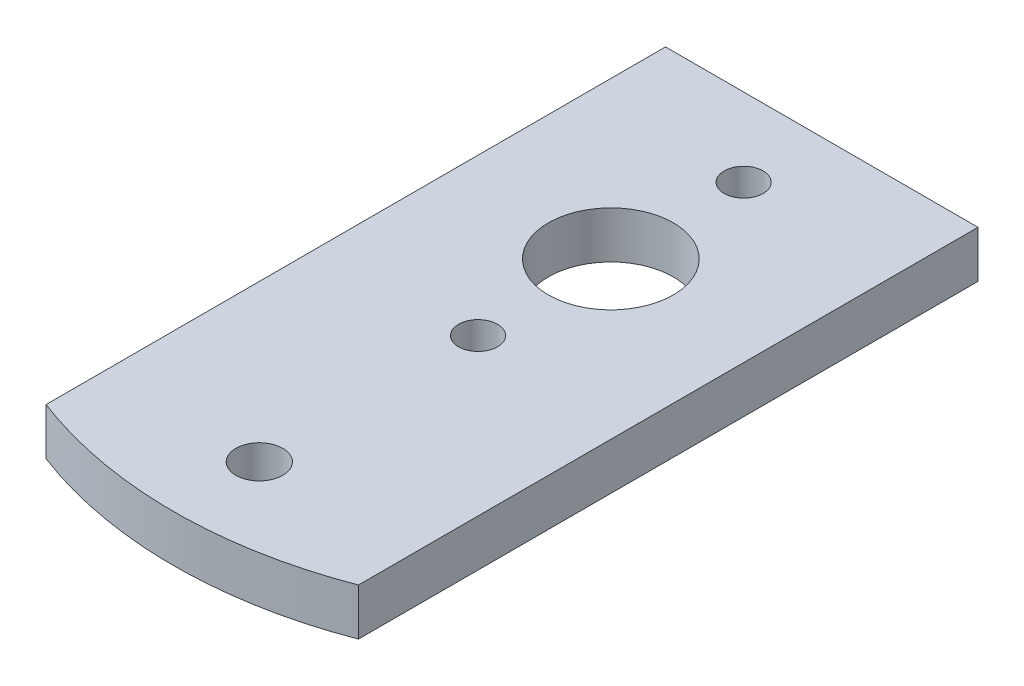
ISO-10303-21;
HEADER;
FILE_DESCRIPTION(('STEP AP214'),'2;1');
FILE_NAME('part.step','',(''),(''),'','','');
FILE_SCHEMA(('AUTOMOTIVE_DESIGN { 1 0 10303 214 1 1 1 1 }'));
ENDSEC;
DATA;
#1=APPLICATION_CONTEXT('core data for automotive mechanical design processes');
#2=APPLICATION_PROTOCOL_DEFINITION('international standard','automotive_design',2000,#1);
#3=PRODUCT_CONTEXT('',#1,'mechanical');
#4=PRODUCT('Part','Part','',(#3));
#5=PRODUCT_RELATED_PRODUCT_CATEGORY('part','',(#4));
#6=PRODUCT_DEFINITION_FORMATION('','',#4);
#7=PRODUCT_DEFINITION_CONTEXT('part definition',#1,'design');
#8=PRODUCT_DEFINITION('design','',#6,#7);
#9=PRODUCT_DEFINITION_SHAPE('','',#8);
#10=(LENGTH_UNIT() NAMED_UNIT(*) SI_UNIT(.MILLI.,.METRE.));
#11=(NAMED_UNIT(*) PLANE_ANGLE_UNIT() SI_UNIT($,.RADIAN.));
#12=(NAMED_UNIT(*) SI_UNIT($,.STERADIAN.) SOLID_ANGLE_UNIT());
#13=UNCERTAINTY_MEASURE_WITH_UNIT(LENGTH_MEASURE(1.E-05),#10,'distance_accuracy_value','');
#14=(GEOMETRIC_REPRESENTATION_CONTEXT(3) GLOBAL_UNCERTAINTY_ASSIGNED_CONTEXT((#13)) GLOBAL_UNIT_ASSIGNED_CONTEXT((#10,
#11,#12)) REPRESENTATION_CONTEXT('',''));
#15=CARTESIAN_POINT('',(0.,0.,0.));
#16=DIRECTION('',(0.,0.,1.));
#17=DIRECTION('',(1.,0.,0.));
#18=AXIS2_PLACEMENT_3D('',#15,#16,#17);
#19=CARTESIAN_POINT('',(0.,3.,0.));
#20=DIRECTION('',(0.,-1.,0.));
#21=DIRECTION('',(0.,0.,-1.));
#22=AXIS2_PLACEMENT_3D('',#19,#20,#21);
#23=PLANE('',#22);
#24=CARTESIAN_POINT('',(0.,3.,13.));
#25=DIRECTION('',(0.,1.,0.));
#26=DIRECTION('',(0.,0.,1.));
#27=AXIS2_PLACEMENT_3D('',#24,#25,#26);
#28=CIRCLE('',#27,1.5);
#29=CARTESIAN_POINT('',(0.,3.,14.5));
#30=VERTEX_POINT('',#29);
#31=EDGE_CURVE('E130',#30,#30,#28,.T.);
#32=ORIENTED_EDGE('',*,*,#31,.F.);
#33=EDGE_LOOP('',(#32));
#34=FACE_BOUND('',#33,.T.);
#35=CARTESIAN_POINT('',(0.,3.,-9.5));
#36=DIRECTION('',(0.,1.,0.));
#37=DIRECTION('',(0.,0.,1.));
#38=AXIS2_PLACEMENT_3D('',#35,#36,#37);
#39=CIRCLE('',#38,4.);
#40=CARTESIAN_POINT('',(0.,3.,-5.5));
#41=VERTEX_POINT('',#40);
#42=EDGE_CURVE('E122',#41,#41,#39,.T.);
#43=ORIENTED_EDGE('',*,*,#42,.F.);
#44=EDGE_LOOP('',(#43));
#45=FACE_BOUND('',#44,.T.);
#46=CARTESIAN_POINT('',(0.,3.,-1.));
#47=DIRECTION('',(0.,1.,0.));
#48=DIRECTION('',(0.,0.,1.));
#49=AXIS2_PLACEMENT_3D('',#46,#47,#48);
#50=CIRCLE('',#49,1.25);
#51=CARTESIAN_POINT('',(0.,3.,0.25));
#52=VERTEX_POINT('',#51);
#53=EDGE_CURVE('E114',#52,#52,#50,.T.);
#54=ORIENTED_EDGE('',*,*,#53,.F.);
#55=EDGE_LOOP('',(#54));
#56=FACE_BOUND('',#55,.T.);
#57=CARTESIAN_POINT('',(0.,3.,-18.));
#58=DIRECTION('',(0.,1.,0.));
#59=DIRECTION('',(0.,0.,1.));
#60=AXIS2_PLACEMENT_3D('',#57,#58,#59);
#61=CIRCLE('',#60,1.25);
#62=CARTESIAN_POINT('',(0.,3.,-16.75));
#63=VERTEX_POINT('',#62);
#64=EDGE_CURVE('E105',#63,#63,#61,.T.);
#65=ORIENTED_EDGE('',*,*,#64,.F.);
#66=EDGE_LOOP('',(#65));
#67=FACE_BOUND('',#66,.T.);
#68=CARTESIAN_POINT('',(0.,3.,-9.5));
#69=DIRECTION('',(0.,1.,0.));
#70=DIRECTION('',(0.,0.,1.));
#71=AXIS2_PLACEMENT_3D('',#68,#69,#70);
#72=CIRCLE('',#71,28.);
#73=CARTESIAN_POINT('',(-10.,3.,16.653393661244));
#74=VERTEX_POINT('',#73);
#75=CARTESIAN_POINT('',(10.,3.,16.653393661244));
#76=VERTEX_POINT('',#75);
#77=EDGE_CURVE('E55',#74,#76,#72,.T.);
#78=ORIENTED_EDGE('',*,*,#77,.T.);
#79=DIRECTION('',(0.,0.,-1.));
#80=VECTOR('',#79,1.);
#81=CARTESIAN_POINT('',(10.,3.,23.));
#82=LINE('',#81,#80);
#83=CARTESIAN_POINT('',(10.,3.,-23.));
#84=VERTEX_POINT('',#83);
#85=EDGE_CURVE('E98',#76,#84,#82,.T.);
#86=ORIENTED_EDGE('',*,*,#85,.T.);
#87=DIRECTION('',(-1.,0.,0.));
#88=VECTOR('',#87,1.);
#89=CARTESIAN_POINT('',(-10.,3.,-23.));
#90=LINE('',#89,#88);
#91=CARTESIAN_POINT('',(-10.,3.,-23.));
#92=VERTEX_POINT('',#91);
#93=EDGE_CURVE('E64',#84,#92,#90,.T.);
#94=ORIENTED_EDGE('',*,*,#93,.T.);
#95=DIRECTION('',(0.,0.,1.));
#96=VECTOR('',#95,1.);
#97=CARTESIAN_POINT('',(-10.,3.,23.));
#98=LINE('',#97,#96);
#99=EDGE_CURVE('E91',#92,#74,#98,.T.);
#100=ORIENTED_EDGE('',*,*,#99,.T.);
#101=EDGE_LOOP('',(#78,#86,#94,#100));
#102=FACE_BOUND('',#101,.T.);
#103=ADVANCED_FACE('F39',(#34,#45,#56,#67,#102),#23,.F.);
#104=CARTESIAN_POINT('',(0.,0.,0.));
#105=DIRECTION('',(0.,-1.,0.));
#106=DIRECTION('',(0.,0.,-1.));
#107=AXIS2_PLACEMENT_3D('',#104,#105,#106);
#108=PLANE('',#107);
#109=CARTESIAN_POINT('',(0.,0.,-9.5));
#110=DIRECTION('',(0.,1.,0.));
#111=DIRECTION('',(0.,0.,1.));
#112=AXIS2_PLACEMENT_3D('',#109,#110,#111);
#113=CIRCLE('',#112,4.);
#114=CARTESIAN_POINT('',(0.,0.,-5.5));
#115=VERTEX_POINT('',#114);
#116=EDGE_CURVE('E126',#115,#115,#113,.T.);
#117=ORIENTED_EDGE('',*,*,#116,.T.);
#118=EDGE_LOOP('',(#117));
#119=FACE_BOUND('',#118,.T.);
#120=CARTESIAN_POINT('',(0.,0.,-18.));
#121=DIRECTION('',(0.,1.,0.));
#122=DIRECTION('',(0.,0.,1.));
#123=AXIS2_PLACEMENT_3D('',#120,#121,#122);
#124=CIRCLE('',#123,1.25);
#125=CARTESIAN_POINT('',(0.,0.,-16.75));
#126=VERTEX_POINT('',#125);
#127=EDGE_CURVE('E110',#126,#126,#124,.T.);
#128=ORIENTED_EDGE('',*,*,#127,.T.);
#129=EDGE_LOOP('',(#128));
#130=FACE_BOUND('',#129,.T.);
#131=CARTESIAN_POINT('',(0.,0.,-1.));
#132=DIRECTION('',(0.,1.,0.));
#133=DIRECTION('',(0.,0.,1.));
#134=AXIS2_PLACEMENT_3D('',#131,#132,#133);
#135=CIRCLE('',#134,1.25);
#136=CARTESIAN_POINT('',(0.,0.,0.25));
#137=VERTEX_POINT('',#136);
#138=EDGE_CURVE('E118',#137,#137,#135,.T.);
#139=ORIENTED_EDGE('',*,*,#138,.T.);
#140=EDGE_LOOP('',(#139));
#141=FACE_BOUND('',#140,.T.);
#142=CARTESIAN_POINT('',(0.,0.,13.));
#143=DIRECTION('',(0.,1.,0.));
#144=DIRECTION('',(0.,0.,1.));
#145=AXIS2_PLACEMENT_3D('',#142,#143,#144);
#146=CIRCLE('',#145,1.5);
#147=CARTESIAN_POINT('',(0.,0.,14.5));
#148=VERTEX_POINT('',#147);
#149=EDGE_CURVE('E134',#148,#148,#146,.T.);
#150=ORIENTED_EDGE('',*,*,#149,.T.);
#151=EDGE_LOOP('',(#150));
#152=FACE_BOUND('',#151,.T.);
#153=DIRECTION('',(0.,0.,-1.));
#154=VECTOR('',#153,1.);
#155=CARTESIAN_POINT('',(10.,0.,23.));
#156=LINE('',#155,#154);
#157=CARTESIAN_POINT('',(10.,0.,16.653393661244));
#158=VERTEX_POINT('',#157);
#159=CARTESIAN_POINT('',(10.,0.,-23.));
#160=VERTEX_POINT('',#159);
#161=EDGE_CURVE('E86',#158,#160,#156,.T.);
#162=ORIENTED_EDGE('',*,*,#161,.F.);
#163=CARTESIAN_POINT('',(0.,0.,-9.5));
#164=DIRECTION('',(0.,1.,0.));
#165=DIRECTION('',(0.,0.,1.));
#166=AXIS2_PLACEMENT_3D('',#163,#164,#165);
#167=CIRCLE('',#166,28.);
#168=CARTESIAN_POINT('',(-10.,0.,16.653393661244));
#169=VERTEX_POINT('',#168);
#170=EDGE_CURVE('E96',#169,#158,#167,.T.);
#171=ORIENTED_EDGE('',*,*,#170,.F.);
#172=DIRECTION('',(0.,0.,1.));
#173=VECTOR('',#172,1.);
#174=CARTESIAN_POINT('',(-10.,0.,23.));
#175=LINE('',#174,#173);
#176=CARTESIAN_POINT('',(-10.,0.,-23.));
#177=VERTEX_POINT('',#176);
#178=EDGE_CURVE('E85',#177,#169,#175,.T.);
#179=ORIENTED_EDGE('',*,*,#178,.F.);
#180=DIRECTION('',(-1.,0.,0.));
#181=VECTOR('',#180,1.);
#182=CARTESIAN_POINT('',(-10.,0.,-23.));
#183=LINE('',#182,#181);
#184=EDGE_CURVE('E76',#160,#177,#183,.T.);
#185=ORIENTED_EDGE('',*,*,#184,.F.);
#186=EDGE_LOOP('',(#162,#171,#179,#185));
#187=FACE_BOUND('',#186,.T.);
#188=ADVANCED_FACE('F94',(#119,#130,#141,#152,#187),#108,.T.);
#189=CARTESIAN_POINT('',(10.,3.,23.));
#190=DIRECTION('',(-1.,0.,0.));
#191=DIRECTION('',(0.,0.,1.));
#192=AXIS2_PLACEMENT_3D('',#189,#190,#191);
#193=PLANE('',#192);
#194=DIRECTION('',(0.,1.,0.));
#195=VECTOR('',#194,1.);
#196=CARTESIAN_POINT('',(10.,0.,16.653393661244));
#197=LINE('',#196,#195);
#198=EDGE_CURVE('E142',#158,#76,#197,.T.);
#199=ORIENTED_EDGE('',*,*,#198,.F.);
#200=ORIENTED_EDGE('',*,*,#161,.T.);
#201=DIRECTION('',(0.,-1.,0.));
#202=VECTOR('',#201,1.);
#203=CARTESIAN_POINT('',(10.,3.,-23.));
#204=LINE('',#203,#202);
#205=EDGE_CURVE('E11',#84,#160,#204,.T.);
#206=ORIENTED_EDGE('',*,*,#205,.F.);
#207=ORIENTED_EDGE('',*,*,#85,.F.);
#208=EDGE_LOOP('',(#199,#200,#206,#207));
#209=FACE_BOUND('',#208,.T.);
#210=ADVANCED_FACE('F41',(#209),#193,.F.);
#211=CARTESIAN_POINT('',(-10.,3.,23.));
#212=DIRECTION('',(1.,0.,0.));
#213=DIRECTION('',(0.,0.,-1.));
#214=AXIS2_PLACEMENT_3D('',#211,#212,#213);
#215=PLANE('',#214);
#216=DIRECTION('',(0.,1.,0.));
#217=VECTOR('',#216,1.);
#218=CARTESIAN_POINT('',(-10.,0.,16.653393661244));
#219=LINE('',#218,#217);
#220=EDGE_CURVE('E138',#169,#74,#219,.T.);
#221=ORIENTED_EDGE('',*,*,#220,.T.);
#222=ORIENTED_EDGE('',*,*,#99,.F.);
#223=DIRECTION('',(0.,-1.,0.));
#224=VECTOR('',#223,1.);
#225=CARTESIAN_POINT('',(-10.,3.,-23.));
#226=LINE('',#225,#224);
#227=EDGE_CURVE('E48',#92,#177,#226,.T.);
#228=ORIENTED_EDGE('',*,*,#227,.T.);
#229=ORIENTED_EDGE('',*,*,#178,.T.);
#230=EDGE_LOOP('',(#221,#222,#228,#229));
#231=FACE_BOUND('',#230,.T.);
#232=ADVANCED_FACE('F90',(#231),#215,.F.);
#233=CARTESIAN_POINT('',(-10.,3.,-23.));
#234=DIRECTION('',(0.,0.,1.));
#235=DIRECTION('',(1.,0.,0.));
#236=AXIS2_PLACEMENT_3D('',#233,#234,#235);
#237=PLANE('',#236);
#238=ORIENTED_EDGE('',*,*,#184,.T.);
#239=ORIENTED_EDGE('',*,*,#227,.F.);
#240=ORIENTED_EDGE('',*,*,#93,.F.);
#241=ORIENTED_EDGE('',*,*,#205,.T.);
#242=EDGE_LOOP('',(#238,#239,#240,#241));
#243=FACE_BOUND('',#242,.T.);
#244=ADVANCED_FACE('F78',(#243),#237,.F.);
#245=CARTESIAN_POINT('',(0.,3.,-18.));
#246=DIRECTION('',(0.,-1.,0.));
#247=DIRECTION('',(0.,0.,-1.));
#248=AXIS2_PLACEMENT_3D('',#245,#246,#247);
#249=CYLINDRICAL_SURFACE('',#248,1.25);
#250=ORIENTED_EDGE('',*,*,#64,.T.);
#251=EDGE_LOOP('',(#250));
#252=FACE_BOUND('',#251,.T.);
#253=ORIENTED_EDGE('',*,*,#127,.F.);
#254=EDGE_LOOP('',(#253));
#255=FACE_BOUND('',#254,.T.);
#256=ADVANCED_FACE('F168',(#252,#255),#249,.F.);
#257=CARTESIAN_POINT('',(0.,3.,-1.));
#258=DIRECTION('',(0.,-1.,0.));
#259=DIRECTION('',(0.,0.,-1.));
#260=AXIS2_PLACEMENT_3D('',#257,#258,#259);
#261=CYLINDRICAL_SURFACE('',#260,1.25);
#262=ORIENTED_EDGE('',*,*,#53,.T.);
#263=EDGE_LOOP('',(#262));
#264=FACE_BOUND('',#263,.T.);
#265=ORIENTED_EDGE('',*,*,#138,.F.);
#266=EDGE_LOOP('',(#265));
#267=FACE_BOUND('',#266,.T.);
#268=ADVANCED_FACE('F176',(#264,#267),#261,.F.);
#269=CARTESIAN_POINT('',(0.,3.,-9.5));
#270=DIRECTION('',(0.,-1.,0.));
#271=DIRECTION('',(0.,0.,-1.));
#272=AXIS2_PLACEMENT_3D('',#269,#270,#271);
#273=CYLINDRICAL_SURFACE('',#272,4.);
#274=ORIENTED_EDGE('',*,*,#42,.T.);
#275=EDGE_LOOP('',(#274));
#276=FACE_BOUND('',#275,.T.);
#277=ORIENTED_EDGE('',*,*,#116,.F.);
#278=EDGE_LOOP('',(#277));
#279=FACE_BOUND('',#278,.T.);
#280=ADVANCED_FACE('F181',(#276,#279),#273,.F.);
#281=CARTESIAN_POINT('',(0.,3.,13.));
#282=DIRECTION('',(0.,-1.,0.));
#283=DIRECTION('',(0.,0.,-1.));
#284=AXIS2_PLACEMENT_3D('',#281,#282,#283);
#285=CYLINDRICAL_SURFACE('',#284,1.5);
#286=ORIENTED_EDGE('',*,*,#31,.T.);
#287=EDGE_LOOP('',(#286));
#288=FACE_BOUND('',#287,.T.);
#289=ORIENTED_EDGE('',*,*,#149,.F.);
#290=EDGE_LOOP('',(#289));
#291=FACE_BOUND('',#290,.T.);
#292=ADVANCED_FACE('F192',(#288,#291),#285,.F.);
#293=CARTESIAN_POINT('',(0.,0.,-9.5));
#294=DIRECTION('',(0.,1.,0.));
#295=DIRECTION('',(0.,0.,1.));
#296=AXIS2_PLACEMENT_3D('',#293,#294,#295);
#297=CYLINDRICAL_SURFACE('',#296,28.);
#298=ORIENTED_EDGE('',*,*,#77,.F.);
#299=ORIENTED_EDGE('',*,*,#220,.F.);
#300=ORIENTED_EDGE('',*,*,#170,.T.);
#301=ORIENTED_EDGE('',*,*,#198,.T.);
#302=EDGE_LOOP('',(#298,#299,#300,#301));
#303=FACE_BOUND('',#302,.T.);
#304=ADVANCED_FACE('F152',(#303),#297,.T.);
#305=CLOSED_SHELL('',(#103,#188,#210,#232,#244,#256,#268,#280,#292,#304));
#306=MANIFOLD_SOLID_BREP('B2',#305);
#307=ADVANCED_BREP_SHAPE_REPRESENTATION('',(#18,#306),#14);
#308=SHAPE_DEFINITION_REPRESENTATION(#9,#307);
ENDSEC;
END-ISO-10303-21;
